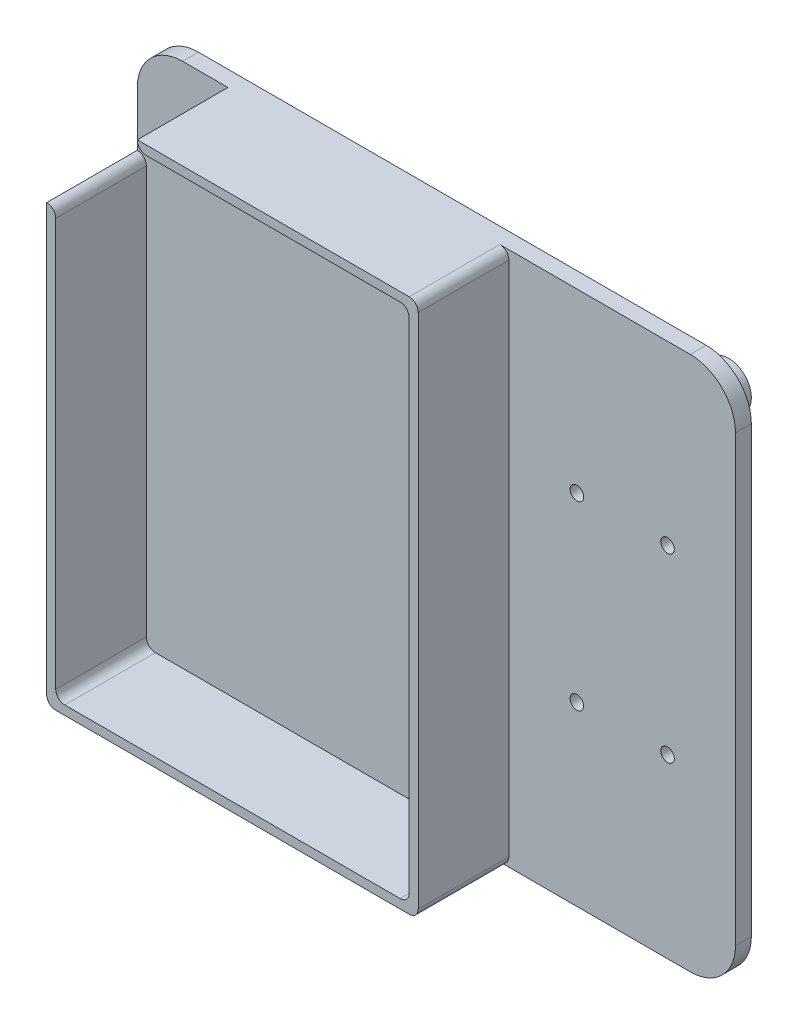
ISO-10303-21;
HEADER;
FILE_DESCRIPTION(('STEP AP214'),'2;1');
FILE_NAME('part.step','',(''),(''),'','','');
FILE_SCHEMA(('AUTOMOTIVE_DESIGN { 1 0 10303 214 1 1 1 1 }'));
ENDSEC;
DATA;
#1=APPLICATION_CONTEXT('core data for automotive mechanical design processes');
#2=APPLICATION_PROTOCOL_DEFINITION('international standard','automotive_design',2000,#1);
#3=PRODUCT_CONTEXT('',#1,'mechanical');
#4=PRODUCT('Part','Part','',(#3));
#5=PRODUCT_RELATED_PRODUCT_CATEGORY('part','',(#4));
#6=PRODUCT_DEFINITION_FORMATION('','',#4);
#7=PRODUCT_DEFINITION_CONTEXT('part definition',#1,'design');
#8=PRODUCT_DEFINITION('design','',#6,#7);
#9=PRODUCT_DEFINITION_SHAPE('','',#8);
#10=(LENGTH_UNIT() NAMED_UNIT(*) SI_UNIT(.MILLI.,.METRE.));
#11=(NAMED_UNIT(*) PLANE_ANGLE_UNIT() SI_UNIT($,.RADIAN.));
#12=(NAMED_UNIT(*) SI_UNIT($,.STERADIAN.) SOLID_ANGLE_UNIT());
#13=UNCERTAINTY_MEASURE_WITH_UNIT(LENGTH_MEASURE(1.E-05),#10,'distance_accuracy_value','');
#14=(GEOMETRIC_REPRESENTATION_CONTEXT(3) GLOBAL_UNCERTAINTY_ASSIGNED_CONTEXT((#13)) GLOBAL_UNIT_ASSIGNED_CONTEXT((#10,
#11,#12)) REPRESENTATION_CONTEXT('',''));
#15=CARTESIAN_POINT('',(0.,0.,0.));
#16=DIRECTION('',(0.,0.,1.));
#17=DIRECTION('',(1.,0.,0.));
#18=AXIS2_PLACEMENT_3D('',#15,#16,#17);
#19=CARTESIAN_POINT('',(-25.,59.,3.5));
#20=DIRECTION('',(0.,-1.,0.));
#21=DIRECTION('',(0.,0.,-1.));
#22=AXIS2_PLACEMENT_3D('',#19,#20,#21);
#23=PLANE('',#22);
#24=DIRECTION('',(-1.,0.,0.));
#25=VECTOR('',#24,1.);
#26=CARTESIAN_POINT('',(0.,59.,23.5));
#27=LINE('',#26,#25);
#28=CARTESIAN_POINT('',(-27.,59.,23.5));
#29=VERTEX_POINT('',#28);
#30=CARTESIAN_POINT('',(-87.,59.,23.5));
#31=VERTEX_POINT('',#30);
#32=EDGE_CURVE('E276',#29,#31,#27,.T.);
#33=ORIENTED_EDGE('',*,*,#32,.F.);
#34=DIRECTION('',(0.,0.,-1.));
#35=VECTOR('',#34,1.);
#36=CARTESIAN_POINT('',(-27.,59.,3.5));
#37=LINE('',#36,#35);
#38=CARTESIAN_POINT('',(-27.,59.,3.5));
#39=VERTEX_POINT('',#38);
#40=EDGE_CURVE('E376',#29,#39,#37,.T.);
#41=ORIENTED_EDGE('',*,*,#40,.T.);
#42=DIRECTION('',(-1.,0.,0.));
#43=VECTOR('',#42,1.);
#44=CARTESIAN_POINT('',(-25.,59.,3.5));
#45=LINE('',#44,#43);
#46=CARTESIAN_POINT('',(15.,59.,3.5));
#47=VERTEX_POINT('',#46);
#48=EDGE_CURVE('E311',#47,#39,#45,.T.);
#49=ORIENTED_EDGE('',*,*,#48,.F.);
#50=DIRECTION('',(0.,0.,-1.));
#51=VECTOR('',#50,1.);
#52=CARTESIAN_POINT('',(15.,59.,3.5));
#53=LINE('',#52,#51);
#54=CARTESIAN_POINT('',(15.,59.,0.));
#55=VERTEX_POINT('',#54);
#56=EDGE_CURVE('E341',#47,#55,#53,.T.);
#57=ORIENTED_EDGE('',*,*,#56,.T.);
#58=DIRECTION('',(-1.,0.,0.));
#59=VECTOR('',#58,1.);
#60=CARTESIAN_POINT('',(-25.,59.,0.));
#61=LINE('',#60,#59);
#62=CARTESIAN_POINT('',(-97.,59.,0.));
#63=VERTEX_POINT('',#62);
#64=EDGE_CURVE('E320',#55,#63,#61,.T.);
#65=ORIENTED_EDGE('',*,*,#64,.T.);
#66=DIRECTION('',(0.,0.,-1.));
#67=VECTOR('',#66,1.);
#68=CARTESIAN_POINT('',(-97.,59.,3.5));
#69=LINE('',#68,#67);
#70=CARTESIAN_POINT('',(-97.,59.,3.5));
#71=VERTEX_POINT('',#70);
#72=EDGE_CURVE('E233',#63,#71,#69,.F.);
#73=ORIENTED_EDGE('',*,*,#72,.T.);
#74=DIRECTION('',(1.,0.,0.));
#75=VECTOR('',#74,1.);
#76=CARTESIAN_POINT('',(-25.,59.,3.5));
#77=LINE('',#76,#75);
#78=CARTESIAN_POINT('',(-87.,59.,3.5));
#79=VERTEX_POINT('',#78);
#80=EDGE_CURVE('E216',#71,#79,#77,.T.);
#81=ORIENTED_EDGE('',*,*,#80,.T.);
#82=DIRECTION('',(0.,0.,-1.));
#83=VECTOR('',#82,1.);
#84=CARTESIAN_POINT('',(-87.,59.,3.5));
#85=LINE('',#84,#83);
#86=EDGE_CURVE('E229',#31,#79,#85,.T.);
#87=ORIENTED_EDGE('',*,*,#86,.F.);
#88=EDGE_LOOP('',(#33,#41,#49,#57,#65,#73,#81,#87));
#89=FACE_BOUND('',#88,.T.);
#90=ADVANCED_FACE('F60',(#89),#23,.F.);
#91=CARTESIAN_POINT('',(0.,0.,23.5));
#92=DIRECTION('',(0.,0.,1.));
#93=DIRECTION('',(1.,0.,0.));
#94=AXIS2_PLACEMENT_3D('',#91,#92,#93);
#95=PLANE('',#94);
#96=DIRECTION('',(0.,-1.,0.));
#97=VECTOR('',#96,1.);
#98=CARTESIAN_POINT('',(-105.,0.,23.5));
#99=LINE('',#98,#97);
#100=CARTESIAN_POINT('',(-105.,35.,23.5));
#101=VERTEX_POINT('',#100);
#102=CARTESIAN_POINT('',(-105.,-55.,23.5));
#103=VERTEX_POINT('',#102);
#104=EDGE_CURVE('E254',#101,#103,#99,.T.);
#105=ORIENTED_EDGE('',*,*,#104,.F.);
#106=CARTESIAN_POINT('',(-107.,35.,23.5));
#107=DIRECTION('',(0.,0.,1.));
#108=DIRECTION('',(1.,0.,0.));
#109=AXIS2_PLACEMENT_3D('',#106,#107,#108);
#110=CIRCLE('',#109,2.);
#111=CARTESIAN_POINT('',(-107.,37.,23.5));
#112=VERTEX_POINT('',#111);
#113=EDGE_CURVE('E358',#101,#112,#110,.T.);
#114=ORIENTED_EDGE('',*,*,#113,.T.);
#115=DIRECTION('',(0.,-1.,0.));
#116=VECTOR('',#115,1.);
#117=CARTESIAN_POINT('',(-107.,0.,23.5));
#118=LINE('',#117,#116);
#119=CARTESIAN_POINT('',(-107.,-57.,23.5));
#120=VERTEX_POINT('',#119);
#121=EDGE_CURVE('E273',#112,#120,#118,.T.);
#122=ORIENTED_EDGE('',*,*,#121,.T.);
#123=CARTESIAN_POINT('',(-105.,-57.,23.5));
#124=DIRECTION('',(0.,0.,1.));
#125=DIRECTION('',(1.,0.,0.));
#126=AXIS2_PLACEMENT_3D('',#123,#124,#125);
#127=CIRCLE('',#126,2.);
#128=CARTESIAN_POINT('',(-105.,-59.,23.5));
#129=VERTEX_POINT('',#128);
#130=EDGE_CURVE('E353',#120,#129,#127,.T.);
#131=ORIENTED_EDGE('',*,*,#130,.T.);
#132=DIRECTION('',(1.,0.,0.));
#133=VECTOR('',#132,1.);
#134=CARTESIAN_POINT('',(0.,-59.,23.5));
#135=LINE('',#134,#133);
#136=CARTESIAN_POINT('',(-27.,-59.,23.5));
#137=VERTEX_POINT('',#136);
#138=EDGE_CURVE('E270',#129,#137,#135,.T.);
#139=ORIENTED_EDGE('',*,*,#138,.T.);
#140=CARTESIAN_POINT('',(-27.,-57.,23.5));
#141=DIRECTION('',(0.,0.,1.));
#142=DIRECTION('',(1.,0.,0.));
#143=AXIS2_PLACEMENT_3D('',#140,#141,#142);
#144=CIRCLE('',#143,2.);
#145=CARTESIAN_POINT('',(-25.,-57.,23.5));
#146=VERTEX_POINT('',#145);
#147=EDGE_CURVE('E355',#137,#146,#144,.T.);
#148=ORIENTED_EDGE('',*,*,#147,.T.);
#149=DIRECTION('',(0.,-1.,0.));
#150=VECTOR('',#149,1.);
#151=CARTESIAN_POINT('',(-25.,0.,23.5));
#152=LINE('',#151,#150);
#153=CARTESIAN_POINT('',(-25.,57.,23.5));
#154=VERTEX_POINT('',#153);
#155=EDGE_CURVE('E267',#154,#146,#152,.T.);
#156=ORIENTED_EDGE('',*,*,#155,.F.);
#157=CARTESIAN_POINT('',(-27.,57.,23.5));
#158=DIRECTION('',(0.,0.,1.));
#159=DIRECTION('',(1.,0.,0.));
#160=AXIS2_PLACEMENT_3D('',#157,#158,#159);
#161=CIRCLE('',#160,2.);
#162=EDGE_CURVE('E351',#154,#29,#161,.T.);
#163=ORIENTED_EDGE('',*,*,#162,.T.);
#164=ORIENTED_EDGE('',*,*,#32,.T.);
#165=CARTESIAN_POINT('',(-85.,59.,23.5));
#166=DIRECTION('',(0.,0.,1.));
#167=DIRECTION('',(1.,0.,0.));
#168=AXIS2_PLACEMENT_3D('',#165,#166,#167);
#169=CIRCLE('',#168,2.);
#170=CARTESIAN_POINT('',(-85.,57.,23.5));
#171=VERTEX_POINT('',#170);
#172=EDGE_CURVE('E238',#31,#171,#169,.T.);
#173=ORIENTED_EDGE('',*,*,#172,.T.);
#174=DIRECTION('',(-1.,0.,0.));
#175=VECTOR('',#174,1.);
#176=CARTESIAN_POINT('',(0.,57.,23.5));
#177=LINE('',#176,#175);
#178=CARTESIAN_POINT('',(-29.,57.,23.5));
#179=VERTEX_POINT('',#178);
#180=EDGE_CURVE('E257',#179,#171,#177,.T.);
#181=ORIENTED_EDGE('',*,*,#180,.F.);
#182=CARTESIAN_POINT('',(-29.,55.,23.5));
#183=DIRECTION('',(0.,0.,1.));
#184=DIRECTION('',(1.,0.,0.));
#185=AXIS2_PLACEMENT_3D('',#182,#183,#184);
#186=CIRCLE('',#185,2.);
#187=CARTESIAN_POINT('',(-27.,55.,23.5));
#188=VERTEX_POINT('',#187);
#189=EDGE_CURVE('E407',#179,#188,#186,.F.);
#190=ORIENTED_EDGE('',*,*,#189,.T.);
#191=DIRECTION('',(0.,-1.,0.));
#192=VECTOR('',#191,1.);
#193=CARTESIAN_POINT('',(-27.,0.,23.5));
#194=LINE('',#193,#192);
#195=CARTESIAN_POINT('',(-27.,-55.,23.5));
#196=VERTEX_POINT('',#195);
#197=EDGE_CURVE('E249',#188,#196,#194,.T.);
#198=ORIENTED_EDGE('',*,*,#197,.T.);
#199=CARTESIAN_POINT('',(-29.,-55.,23.5));
#200=DIRECTION('',(0.,0.,1.));
#201=DIRECTION('',(1.,0.,0.));
#202=AXIS2_PLACEMENT_3D('',#199,#200,#201);
#203=CIRCLE('',#202,2.);
#204=CARTESIAN_POINT('',(-29.,-57.,23.5));
#205=VERTEX_POINT('',#204);
#206=EDGE_CURVE('E405',#196,#205,#203,.F.);
#207=ORIENTED_EDGE('',*,*,#206,.T.);
#208=DIRECTION('',(1.,0.,0.));
#209=VECTOR('',#208,1.);
#210=CARTESIAN_POINT('',(0.,-57.,23.5));
#211=LINE('',#210,#209);
#212=CARTESIAN_POINT('',(-103.,-57.,23.5));
#213=VERTEX_POINT('',#212);
#214=EDGE_CURVE('E251',#213,#205,#211,.T.);
#215=ORIENTED_EDGE('',*,*,#214,.F.);
#216=CARTESIAN_POINT('',(-103.,-55.,23.5));
#217=DIRECTION('',(0.,0.,1.));
#218=DIRECTION('',(1.,0.,0.));
#219=AXIS2_PLACEMENT_3D('',#216,#217,#218);
#220=CIRCLE('',#219,2.);
#221=EDGE_CURVE('E403',#213,#103,#220,.F.);
#222=ORIENTED_EDGE('',*,*,#221,.T.);
#223=EDGE_LOOP('',(#105,#114,#122,#131,#139,#148,#156,#163,#164,#173,#181,#190,#198,#207,#215,#222));
#224=FACE_BOUND('',#223,.T.);
#225=ADVANCED_FACE('F464',(#224),#95,.T.);
#226=CARTESIAN_POINT('',(0.,57.,23.5));
#227=DIRECTION('',(0.,-1.,0.));
#228=DIRECTION('',(0.,0.,-1.));
#229=AXIS2_PLACEMENT_3D('',#226,#227,#228);
#230=PLANE('',#229);
#231=DIRECTION('',(-1.,0.,0.));
#232=VECTOR('',#231,1.);
#233=CARTESIAN_POINT('',(0.,57.,3.5));
#234=LINE('',#233,#232);
#235=CARTESIAN_POINT('',(-29.,57.,3.5));
#236=VERTEX_POINT('',#235);
#237=CARTESIAN_POINT('',(-85.,57.,3.5));
#238=VERTEX_POINT('',#237);
#239=EDGE_CURVE('E218',#236,#238,#234,.T.);
#240=ORIENTED_EDGE('',*,*,#239,.F.);
#241=DIRECTION('',(0.,0.,-1.));
#242=VECTOR('',#241,1.);
#243=CARTESIAN_POINT('',(-29.,57.,23.5));
#244=LINE('',#243,#242);
#245=EDGE_CURVE('E75',#236,#179,#244,.F.);
#246=ORIENTED_EDGE('',*,*,#245,.T.);
#247=ORIENTED_EDGE('',*,*,#180,.T.);
#248=DIRECTION('',(0.,0.,-1.));
#249=VECTOR('',#248,1.);
#250=CARTESIAN_POINT('',(-85.,57.,23.5));
#251=LINE('',#250,#249);
#252=EDGE_CURVE('E360',#171,#238,#251,.T.);
#253=ORIENTED_EDGE('',*,*,#252,.T.);
#254=EDGE_LOOP('',(#240,#246,#247,#253));
#255=FACE_BOUND('',#254,.T.);
#256=ADVANCED_FACE('F506',(#255),#230,.T.);
#257=CARTESIAN_POINT('',(0.,0.,3.5));
#258=DIRECTION('',(0.,0.,1.));
#259=DIRECTION('',(1.,0.,0.));
#260=AXIS2_PLACEMENT_3D('',#257,#258,#259);
#261=PLANE('',#260);
#262=CARTESIAN_POINT('',(9.99999999999999,-20.,3.5));
#263=DIRECTION('',(0.,0.,1.));
#264=DIRECTION('',(-1.,0.,0.));
#265=AXIS2_PLACEMENT_3D('',#262,#263,#264);
#266=CIRCLE('',#265,1.5);
#267=CARTESIAN_POINT('',(8.49999999999999,-20.,3.5));
#268=VERTEX_POINT('',#267);
#269=EDGE_CURVE('E283',#268,#268,#266,.T.);
#270=ORIENTED_EDGE('',*,*,#269,.F.);
#271=EDGE_LOOP('',(#270));
#272=FACE_BOUND('',#271,.T.);
#273=CARTESIAN_POINT('',(9.99999999999999,20.,3.5));
#274=DIRECTION('',(0.,0.,-1.));
#275=DIRECTION('',(-1.,0.,0.));
#276=AXIS2_PLACEMENT_3D('',#273,#274,#275);
#277=CIRCLE('',#276,1.5);
#278=CARTESIAN_POINT('',(8.49999999999999,20.,3.5));
#279=VERTEX_POINT('',#278);
#280=EDGE_CURVE('E287',#279,#279,#277,.T.);
#281=ORIENTED_EDGE('',*,*,#280,.T.);
#282=EDGE_LOOP('',(#281));
#283=FACE_BOUND('',#282,.T.);
#284=CARTESIAN_POINT('',(-9.99999999999999,-20.,3.5));
#285=DIRECTION('',(0.,0.,-1.));
#286=DIRECTION('',(1.,0.,0.));
#287=AXIS2_PLACEMENT_3D('',#284,#285,#286);
#288=CIRCLE('',#287,1.5);
#289=CARTESIAN_POINT('',(-8.49999999999999,-20.,3.5));
#290=VERTEX_POINT('',#289);
#291=EDGE_CURVE('E293',#290,#290,#288,.T.);
#292=ORIENTED_EDGE('',*,*,#291,.T.);
#293=EDGE_LOOP('',(#292));
#294=FACE_BOUND('',#293,.T.);
#295=CARTESIAN_POINT('',(-9.99999999999999,20.,3.5));
#296=DIRECTION('',(0.,0.,1.));
#297=DIRECTION('',(1.,0.,0.));
#298=AXIS2_PLACEMENT_3D('',#295,#296,#297);
#299=CIRCLE('',#298,1.5);
#300=CARTESIAN_POINT('',(-8.49999999999999,20.,3.5));
#301=VERTEX_POINT('',#300);
#302=EDGE_CURVE('E299',#301,#301,#299,.T.);
#303=ORIENTED_EDGE('',*,*,#302,.F.);
#304=EDGE_LOOP('',(#303));
#305=FACE_BOUND('',#304,.T.);
#306=DIRECTION('',(1.,0.,0.));
#307=VECTOR('',#306,1.);
#308=CARTESIAN_POINT('',(-25.,-59.,3.5));
#309=LINE('',#308,#307);
#310=CARTESIAN_POINT('',(-27.,-59.,3.5));
#311=VERTEX_POINT('',#310);
#312=CARTESIAN_POINT('',(15.,-59.,3.5));
#313=VERTEX_POINT('',#312);
#314=EDGE_CURVE('E314',#311,#313,#309,.T.);
#315=ORIENTED_EDGE('',*,*,#314,.T.);
#316=CARTESIAN_POINT('',(15.,-49.,3.5));
#317=DIRECTION('',(0.,0.,1.));
#318=DIRECTION('',(1.,0.,0.));
#319=AXIS2_PLACEMENT_3D('',#316,#317,#318);
#320=CIRCLE('',#319,10.);
#321=CARTESIAN_POINT('',(25.,-49.,3.5));
#322=VERTEX_POINT('',#321);
#323=EDGE_CURVE('E338',#313,#322,#320,.T.);
#324=ORIENTED_EDGE('',*,*,#323,.T.);
#325=DIRECTION('',(0.,1.,0.));
#326=VECTOR('',#325,1.);
#327=CARTESIAN_POINT('',(25.,59.,3.5));
#328=LINE('',#327,#326);
#329=CARTESIAN_POINT('',(25.,49.,3.5));
#330=VERTEX_POINT('',#329);
#331=EDGE_CURVE('E308',#322,#330,#328,.T.);
#332=ORIENTED_EDGE('',*,*,#331,.T.);
#333=CARTESIAN_POINT('',(15.,49.,3.5));
#334=DIRECTION('',(0.,0.,1.));
#335=DIRECTION('',(1.,0.,0.));
#336=AXIS2_PLACEMENT_3D('',#333,#334,#335);
#337=CIRCLE('',#336,10.);
#338=EDGE_CURVE('E336',#330,#47,#337,.T.);
#339=ORIENTED_EDGE('',*,*,#338,.T.);
#340=ORIENTED_EDGE('',*,*,#48,.T.);
#341=CARTESIAN_POINT('',(-27.,57.,3.5));
#342=DIRECTION('',(0.,0.,1.));
#343=DIRECTION('',(1.,0.,0.));
#344=AXIS2_PLACEMENT_3D('',#341,#342,#343);
#345=CIRCLE('',#344,2.);
#346=CARTESIAN_POINT('',(-25.,57.,3.5));
#347=VERTEX_POINT('',#346);
#348=EDGE_CURVE('E382',#39,#347,#345,.F.);
#349=ORIENTED_EDGE('',*,*,#348,.T.);
#350=DIRECTION('',(0.,-1.,0.));
#351=VECTOR('',#350,1.);
#352=CARTESIAN_POINT('',(-25.,0.,3.5));
#353=LINE('',#352,#351);
#354=CARTESIAN_POINT('',(-25.,-57.,3.5));
#355=VERTEX_POINT('',#354);
#356=EDGE_CURVE('E259',#347,#355,#353,.T.);
#357=ORIENTED_EDGE('',*,*,#356,.T.);
#358=CARTESIAN_POINT('',(-27.,-57.,3.5));
#359=DIRECTION('',(0.,0.,1.));
#360=DIRECTION('',(1.,0.,0.));
#361=AXIS2_PLACEMENT_3D('',#358,#359,#360);
#362=CIRCLE('',#361,2.);
#363=EDGE_CURVE('E223',#355,#311,#362,.F.);
#364=ORIENTED_EDGE('',*,*,#363,.T.);
#365=EDGE_LOOP('',(#315,#324,#332,#339,#340,#349,#357,#364));
#366=FACE_BOUND('',#365,.T.);
#367=ADVANCED_FACE('F489',(#272,#283,#294,#305,#366),#261,.T.);
#368=CARTESIAN_POINT('',(25.,59.,3.5));
#369=DIRECTION('',(-1.,0.,0.));
#370=DIRECTION('',(0.,-1.,0.));
#371=AXIS2_PLACEMENT_3D('',#368,#369,#370);
#372=PLANE('',#371);
#373=ORIENTED_EDGE('',*,*,#331,.F.);
#374=DIRECTION('',(0.,0.,-1.));
#375=VECTOR('',#374,1.);
#376=CARTESIAN_POINT('',(25.,-49.,3.5));
#377=LINE('',#376,#375);
#378=CARTESIAN_POINT('',(25.,-49.,0.));
#379=VERTEX_POINT('',#378);
#380=EDGE_CURVE('E324',#322,#379,#377,.T.);
#381=ORIENTED_EDGE('',*,*,#380,.T.);
#382=DIRECTION('',(0.,1.,0.));
#383=VECTOR('',#382,1.);
#384=CARTESIAN_POINT('',(25.,59.,0.));
#385=LINE('',#384,#383);
#386=CARTESIAN_POINT('',(25.,49.,0.));
#387=VERTEX_POINT('',#386);
#388=EDGE_CURVE('E305',#379,#387,#385,.T.);
#389=ORIENTED_EDGE('',*,*,#388,.T.);
#390=DIRECTION('',(0.,0.,-1.));
#391=VECTOR('',#390,1.);
#392=CARTESIAN_POINT('',(25.,49.,3.5));
#393=LINE('',#392,#391);
#394=EDGE_CURVE('E317',#387,#330,#393,.F.);
#395=ORIENTED_EDGE('',*,*,#394,.T.);
#396=EDGE_LOOP('',(#373,#381,#389,#395));
#397=FACE_BOUND('',#396,.T.);
#398=ADVANCED_FACE('F483',(#397),#372,.F.);
#399=CARTESIAN_POINT('',(-25.,-59.,3.5));
#400=DIRECTION('',(0.,1.,0.));
#401=DIRECTION('',(0.,0.,1.));
#402=AXIS2_PLACEMENT_3D('',#399,#400,#401);
#403=PLANE('',#402);
#404=ORIENTED_EDGE('',*,*,#314,.F.);
#405=DIRECTION('',(0.,0.,-1.));
#406=VECTOR('',#405,1.);
#407=CARTESIAN_POINT('',(-27.,-59.,23.5));
#408=LINE('',#407,#406);
#409=EDGE_CURVE('E369',#311,#137,#408,.F.);
#410=ORIENTED_EDGE('',*,*,#409,.T.);
#411=ORIENTED_EDGE('',*,*,#138,.F.);
#412=DIRECTION('',(0.,0.,1.));
#413=VECTOR('',#412,1.);
#414=CARTESIAN_POINT('',(-105.,-59.,0.));
#415=LINE('',#414,#413);
#416=CARTESIAN_POINT('',(-105.,-59.,0.));
#417=VERTEX_POINT('',#416);
#418=EDGE_CURVE('E367',#129,#417,#415,.F.);
#419=ORIENTED_EDGE('',*,*,#418,.T.);
#420=DIRECTION('',(1.,0.,0.));
#421=VECTOR('',#420,1.);
#422=CARTESIAN_POINT('',(-25.,-59.,0.));
#423=LINE('',#422,#421);
#424=CARTESIAN_POINT('',(15.,-59.,0.));
#425=VERTEX_POINT('',#424);
#426=EDGE_CURVE('E312',#417,#425,#423,.T.);
#427=ORIENTED_EDGE('',*,*,#426,.T.);
#428=DIRECTION('',(0.,0.,-1.));
#429=VECTOR('',#428,1.);
#430=CARTESIAN_POINT('',(15.,-59.,3.5));
#431=LINE('',#430,#429);
#432=EDGE_CURVE('E334',#425,#313,#431,.F.);
#433=ORIENTED_EDGE('',*,*,#432,.T.);
#434=EDGE_LOOP('',(#404,#410,#411,#419,#427,#433));
#435=FACE_BOUND('',#434,.T.);
#436=ADVANCED_FACE('F429',(#435),#403,.F.);
#437=CARTESIAN_POINT('',(0.,0.,0.));
#438=DIRECTION('',(0.,0.,1.));
#439=DIRECTION('',(1.,0.,0.));
#440=AXIS2_PLACEMENT_3D('',#437,#438,#439);
#441=PLANE('',#440);
#442=CARTESIAN_POINT('',(-41.,-49.,0.));
#443=DIRECTION('',(0.,0.,1.));
#444=DIRECTION('',(1.,0.,0.));
#445=AXIS2_PLACEMENT_3D('',#442,#443,#444);
#446=CIRCLE('',#445,5.);
#447=CARTESIAN_POINT('',(-36.,-49.,0.));
#448=VERTEX_POINT('',#447);
#449=EDGE_CURVE('E12',#448,#448,#446,.F.);
#450=ORIENTED_EDGE('',*,*,#449,.F.);
#451=EDGE_LOOP('',(#450));
#452=FACE_BOUND('',#451,.T.);
#453=CARTESIAN_POINT('',(-41.,49.,0.));
#454=DIRECTION('',(0.,0.,1.));
#455=DIRECTION('',(1.,0.,0.));
#456=AXIS2_PLACEMENT_3D('',#453,#454,#455);
#457=CIRCLE('',#456,5.);
#458=CARTESIAN_POINT('',(-36.,49.,0.));
#459=VERTEX_POINT('',#458);
#460=EDGE_CURVE('E68',#459,#459,#457,.F.);
#461=ORIENTED_EDGE('',*,*,#460,.F.);
#462=EDGE_LOOP('',(#461));
#463=FACE_BOUND('',#462,.T.);
#464=CARTESIAN_POINT('',(-97.,-49.,0.));
#465=DIRECTION('',(0.,0.,1.));
#466=DIRECTION('',(1.,0.,0.));
#467=AXIS2_PLACEMENT_3D('',#464,#465,#466);
#468=CIRCLE('',#467,5.00000000000001);
#469=CARTESIAN_POINT('',(-92.,-49.,0.));
#470=VERTEX_POINT('',#469);
#471=EDGE_CURVE('E418',#470,#470,#468,.F.);
#472=ORIENTED_EDGE('',*,*,#471,.F.);
#473=EDGE_LOOP('',(#472));
#474=FACE_BOUND('',#473,.T.);
#475=CARTESIAN_POINT('',(15.,-49.,0.));
#476=DIRECTION('',(0.,0.,1.));
#477=DIRECTION('',(1.,0.,0.));
#478=AXIS2_PLACEMENT_3D('',#475,#476,#477);
#479=CIRCLE('',#478,5.);
#480=CARTESIAN_POINT('',(20.,-49.,0.));
#481=VERTEX_POINT('',#480);
#482=EDGE_CURVE('E415',#481,#481,#479,.F.);
#483=ORIENTED_EDGE('',*,*,#482,.F.);
#484=EDGE_LOOP('',(#483));
#485=FACE_BOUND('',#484,.T.);
#486=CARTESIAN_POINT('',(-97.,49.,0.));
#487=DIRECTION('',(0.,0.,1.));
#488=DIRECTION('',(1.,0.,0.));
#489=AXIS2_PLACEMENT_3D('',#486,#487,#488);
#490=CIRCLE('',#489,5.00000000000001);
#491=CARTESIAN_POINT('',(-92.,49.,0.));
#492=VERTEX_POINT('',#491);
#493=EDGE_CURVE('E412',#492,#492,#490,.F.);
#494=ORIENTED_EDGE('',*,*,#493,.F.);
#495=EDGE_LOOP('',(#494));
#496=FACE_BOUND('',#495,.T.);
#497=CARTESIAN_POINT('',(15.,49.,0.));
#498=DIRECTION('',(0.,0.,1.));
#499=DIRECTION('',(1.,0.,0.));
#500=AXIS2_PLACEMENT_3D('',#497,#498,#499);
#501=CIRCLE('',#500,5.);
#502=CARTESIAN_POINT('',(20.,49.,0.));
#503=VERTEX_POINT('',#502);
#504=EDGE_CURVE('E409',#503,#503,#501,.F.);
#505=ORIENTED_EDGE('',*,*,#504,.F.);
#506=EDGE_LOOP('',(#505));
#507=FACE_BOUND('',#506,.T.);
#508=CARTESIAN_POINT('',(9.99999999999999,-20.,0.));
#509=DIRECTION('',(0.,0.,1.));
#510=DIRECTION('',(-1.,0.,0.));
#511=AXIS2_PLACEMENT_3D('',#508,#509,#510);
#512=CIRCLE('',#511,1.5);
#513=CARTESIAN_POINT('',(8.49999999999999,-20.,0.));
#514=VERTEX_POINT('',#513);
#515=EDGE_CURVE('E284',#514,#514,#512,.T.);
#516=ORIENTED_EDGE('',*,*,#515,.T.);
#517=EDGE_LOOP('',(#516));
#518=FACE_BOUND('',#517,.T.);
#519=CARTESIAN_POINT('',(9.99999999999999,20.,0.));
#520=DIRECTION('',(0.,0.,-1.));
#521=DIRECTION('',(-1.,0.,0.));
#522=AXIS2_PLACEMENT_3D('',#519,#520,#521);
#523=CIRCLE('',#522,1.5);
#524=CARTESIAN_POINT('',(8.49999999999999,20.,0.));
#525=VERTEX_POINT('',#524);
#526=EDGE_CURVE('E290',#525,#525,#523,.T.);
#527=ORIENTED_EDGE('',*,*,#526,.F.);
#528=EDGE_LOOP('',(#527));
#529=FACE_BOUND('',#528,.T.);
#530=CARTESIAN_POINT('',(-9.99999999999999,-20.,0.));
#531=DIRECTION('',(0.,0.,-1.));
#532=DIRECTION('',(1.,0.,0.));
#533=AXIS2_PLACEMENT_3D('',#530,#531,#532);
#534=CIRCLE('',#533,1.5);
#535=CARTESIAN_POINT('',(-8.49999999999999,-20.,0.));
#536=VERTEX_POINT('',#535);
#537=EDGE_CURVE('E296',#536,#536,#534,.T.);
#538=ORIENTED_EDGE('',*,*,#537,.F.);
#539=EDGE_LOOP('',(#538));
#540=FACE_BOUND('',#539,.T.);
#541=CARTESIAN_POINT('',(-9.99999999999999,20.,0.));
#542=DIRECTION('',(0.,0.,1.));
#543=DIRECTION('',(1.,0.,0.));
#544=AXIS2_PLACEMENT_3D('',#541,#542,#543);
#545=CIRCLE('',#544,1.5);
#546=CARTESIAN_POINT('',(-8.49999999999999,20.,0.));
#547=VERTEX_POINT('',#546);
#548=EDGE_CURVE('E302',#547,#547,#545,.T.);
#549=ORIENTED_EDGE('',*,*,#548,.T.);
#550=EDGE_LOOP('',(#549));
#551=FACE_BOUND('',#550,.T.);
#552=ORIENTED_EDGE('',*,*,#426,.F.);
#553=CARTESIAN_POINT('',(-105.,-57.,0.));
#554=DIRECTION('',(0.,0.,1.));
#555=DIRECTION('',(1.,0.,0.));
#556=AXIS2_PLACEMENT_3D('',#553,#554,#555);
#557=CIRCLE('',#556,2.);
#558=CARTESIAN_POINT('',(-107.,-57.,0.));
#559=VERTEX_POINT('',#558);
#560=EDGE_CURVE('E374',#417,#559,#557,.F.);
#561=ORIENTED_EDGE('',*,*,#560,.T.);
#562=DIRECTION('',(0.,-1.,0.));
#563=VECTOR('',#562,1.);
#564=CARTESIAN_POINT('',(-107.,59.,0.));
#565=LINE('',#564,#563);
#566=CARTESIAN_POINT('',(-107.,49.,0.));
#567=VERTEX_POINT('',#566);
#568=EDGE_CURVE('E278',#567,#559,#565,.T.);
#569=ORIENTED_EDGE('',*,*,#568,.F.);
#570=CARTESIAN_POINT('',(-97.,49.,0.));
#571=DIRECTION('',(0.,0.,1.));
#572=DIRECTION('',(1.,0.,0.));
#573=AXIS2_PLACEMENT_3D('',#570,#571,#572);
#574=CIRCLE('',#573,10.);
#575=EDGE_CURVE('E327',#567,#63,#574,.F.);
#576=ORIENTED_EDGE('',*,*,#575,.T.);
#577=ORIENTED_EDGE('',*,*,#64,.F.);
#578=CARTESIAN_POINT('',(15.,49.,0.));
#579=DIRECTION('',(0.,0.,1.));
#580=DIRECTION('',(1.,0.,0.));
#581=AXIS2_PLACEMENT_3D('',#578,#579,#580);
#582=CIRCLE('',#581,10.);
#583=EDGE_CURVE('E329',#55,#387,#582,.F.);
#584=ORIENTED_EDGE('',*,*,#583,.T.);
#585=ORIENTED_EDGE('',*,*,#388,.F.);
#586=CARTESIAN_POINT('',(15.,-49.,0.));
#587=DIRECTION('',(0.,0.,1.));
#588=DIRECTION('',(1.,0.,0.));
#589=AXIS2_PLACEMENT_3D('',#586,#587,#588);
#590=CIRCLE('',#589,10.);
#591=EDGE_CURVE('E331',#379,#425,#590,.F.);
#592=ORIENTED_EDGE('',*,*,#591,.T.);
#593=EDGE_LOOP('',(#552,#561,#569,#576,#577,#584,#585,#592));
#594=FACE_BOUND('',#593,.T.);
#595=ADVANCED_FACE('F425',(#452,#463,#474,#485,#496,#507,#518,#529,#540,#551,#594),#441,.F.);
#596=CARTESIAN_POINT('',(-9.99999999999999,20.,0.));
#597=DIRECTION('',(0.,0.,1.));
#598=DIRECTION('',(1.,0.,0.));
#599=AXIS2_PLACEMENT_3D('',#596,#597,#598);
#600=CYLINDRICAL_SURFACE('',#599,1.5);
#601=ORIENTED_EDGE('',*,*,#548,.F.);
#602=EDGE_LOOP('',(#601));
#603=FACE_BOUND('',#602,.T.);
#604=ORIENTED_EDGE('',*,*,#302,.T.);
#605=EDGE_LOOP('',(#604));
#606=FACE_BOUND('',#605,.T.);
#607=ADVANCED_FACE('F428',(#603,#606),#600,.F.);
#608=CARTESIAN_POINT('',(-9.99999999999999,-20.,0.));
#609=DIRECTION('',(0.,0.,1.));
#610=DIRECTION('',(1.,0.,0.));
#611=AXIS2_PLACEMENT_3D('',#608,#609,#610);
#612=CYLINDRICAL_SURFACE('',#611,1.5);
#613=ORIENTED_EDGE('',*,*,#537,.T.);
#614=EDGE_LOOP('',(#613));
#615=FACE_BOUND('',#614,.T.);
#616=ORIENTED_EDGE('',*,*,#291,.F.);
#617=EDGE_LOOP('',(#616));
#618=FACE_BOUND('',#617,.T.);
#619=ADVANCED_FACE('F799',(#615,#618),#612,.F.);
#620=CARTESIAN_POINT('',(9.99999999999999,20.,0.));
#621=DIRECTION('',(0.,0.,1.));
#622=DIRECTION('',(1.,0.,0.));
#623=AXIS2_PLACEMENT_3D('',#620,#621,#622);
#624=CYLINDRICAL_SURFACE('',#623,1.5);
#625=ORIENTED_EDGE('',*,*,#526,.T.);
#626=EDGE_LOOP('',(#625));
#627=FACE_BOUND('',#626,.T.);
#628=ORIENTED_EDGE('',*,*,#280,.F.);
#629=EDGE_LOOP('',(#628));
#630=FACE_BOUND('',#629,.T.);
#631=ADVANCED_FACE('F806',(#627,#630),#624,.F.);
#632=CARTESIAN_POINT('',(9.99999999999999,-20.,0.));
#633=DIRECTION('',(0.,0.,1.));
#634=DIRECTION('',(1.,0.,0.));
#635=AXIS2_PLACEMENT_3D('',#632,#633,#634);
#636=CYLINDRICAL_SURFACE('',#635,1.5);
#637=ORIENTED_EDGE('',*,*,#515,.F.);
#638=EDGE_LOOP('',(#637));
#639=FACE_BOUND('',#638,.T.);
#640=ORIENTED_EDGE('',*,*,#269,.T.);
#641=EDGE_LOOP('',(#640));
#642=FACE_BOUND('',#641,.T.);
#643=ADVANCED_FACE('F814',(#639,#642),#636,.F.);
#644=CARTESIAN_POINT('',(-107.,0.,0.));
#645=DIRECTION('',(-1.,0.,0.));
#646=DIRECTION('',(0.,-1.,0.));
#647=AXIS2_PLACEMENT_3D('',#644,#645,#646);
#648=PLANE('',#647);
#649=ORIENTED_EDGE('',*,*,#568,.T.);
#650=DIRECTION('',(0.,0.,1.));
#651=VECTOR('',#650,1.);
#652=CARTESIAN_POINT('',(-107.,-57.,23.5));
#653=LINE('',#652,#651);
#654=EDGE_CURVE('E371',#559,#120,#653,.T.);
#655=ORIENTED_EDGE('',*,*,#654,.T.);
#656=ORIENTED_EDGE('',*,*,#121,.F.);
#657=DIRECTION('',(0.,0.,-1.));
#658=VECTOR('',#657,1.);
#659=CARTESIAN_POINT('',(-107.,37.,0.));
#660=LINE('',#659,#658);
#661=CARTESIAN_POINT('',(-107.,37.,3.5));
#662=VERTEX_POINT('',#661);
#663=EDGE_CURVE('E239',#112,#662,#660,.T.);
#664=ORIENTED_EDGE('',*,*,#663,.T.);
#665=DIRECTION('',(0.,1.,0.));
#666=VECTOR('',#665,1.);
#667=CARTESIAN_POINT('',(-107.,37.,3.5));
#668=LINE('',#667,#666);
#669=CARTESIAN_POINT('',(-107.,49.,3.5));
#670=VERTEX_POINT('',#669);
#671=EDGE_CURVE('E242',#662,#670,#668,.T.);
#672=ORIENTED_EDGE('',*,*,#671,.T.);
#673=DIRECTION('',(0.,0.,-1.));
#674=VECTOR('',#673,1.);
#675=CARTESIAN_POINT('',(-107.,49.,0.));
#676=LINE('',#675,#674);
#677=EDGE_CURVE('E344',#670,#567,#676,.T.);
#678=ORIENTED_EDGE('',*,*,#677,.T.);
#679=EDGE_LOOP('',(#649,#655,#656,#664,#672,#678));
#680=FACE_BOUND('',#679,.T.);
#681=ADVANCED_FACE('F460',(#680),#648,.T.);
#682=CARTESIAN_POINT('',(-25.,0.,23.5));
#683=DIRECTION('',(1.,0.,0.));
#684=DIRECTION('',(0.,1.,0.));
#685=AXIS2_PLACEMENT_3D('',#682,#683,#684);
#686=PLANE('',#685);
#687=ORIENTED_EDGE('',*,*,#155,.T.);
#688=DIRECTION('',(0.,0.,-1.));
#689=VECTOR('',#688,1.);
#690=CARTESIAN_POINT('',(-25.,-57.,3.5));
#691=LINE('',#690,#689);
#692=EDGE_CURVE('E364',#146,#355,#691,.T.);
#693=ORIENTED_EDGE('',*,*,#692,.T.);
#694=ORIENTED_EDGE('',*,*,#356,.F.);
#695=DIRECTION('',(0.,0.,-1.));
#696=VECTOR('',#695,1.);
#697=CARTESIAN_POINT('',(-25.,57.,23.5));
#698=LINE('',#697,#696);
#699=EDGE_CURVE('E362',#347,#154,#698,.F.);
#700=ORIENTED_EDGE('',*,*,#699,.T.);
#701=EDGE_LOOP('',(#687,#693,#694,#700));
#702=FACE_BOUND('',#701,.T.);
#703=ADVANCED_FACE('F499',(#702),#686,.T.);
#704=CARTESIAN_POINT('',(-27.,0.,23.5));
#705=DIRECTION('',(1.,0.,0.));
#706=DIRECTION('',(0.,1.,0.));
#707=AXIS2_PLACEMENT_3D('',#704,#705,#706);
#708=PLANE('',#707);
#709=DIRECTION('',(0.,-1.,0.));
#710=VECTOR('',#709,1.);
#711=CARTESIAN_POINT('',(-27.,0.,3.5));
#712=LINE('',#711,#710);
#713=CARTESIAN_POINT('',(-27.,55.,3.5));
#714=VERTEX_POINT('',#713);
#715=CARTESIAN_POINT('',(-27.,-55.,3.5));
#716=VERTEX_POINT('',#715);
#717=EDGE_CURVE('E248',#714,#716,#712,.T.);
#718=ORIENTED_EDGE('',*,*,#717,.T.);
#719=DIRECTION('',(0.,0.,-1.));
#720=VECTOR('',#719,1.);
#721=CARTESIAN_POINT('',(-27.,-55.,23.5));
#722=LINE('',#721,#720);
#723=EDGE_CURVE('E83',#716,#196,#722,.F.);
#724=ORIENTED_EDGE('',*,*,#723,.T.);
#725=ORIENTED_EDGE('',*,*,#197,.F.);
#726=DIRECTION('',(0.,0.,-1.));
#727=VECTOR('',#726,1.);
#728=CARTESIAN_POINT('',(-27.,55.,23.5));
#729=LINE('',#728,#727);
#730=EDGE_CURVE('E398',#188,#714,#729,.T.);
#731=ORIENTED_EDGE('',*,*,#730,.T.);
#732=EDGE_LOOP('',(#718,#724,#725,#731));
#733=FACE_BOUND('',#732,.T.);
#734=ADVANCED_FACE('F510',(#733),#708,.F.);
#735=CARTESIAN_POINT('',(-105.,0.,23.5));
#736=DIRECTION('',(1.,0.,0.));
#737=DIRECTION('',(0.,1.,0.));
#738=AXIS2_PLACEMENT_3D('',#735,#736,#737);
#739=PLANE('',#738);
#740=ORIENTED_EDGE('',*,*,#104,.T.);
#741=DIRECTION('',(0.,0.,-1.));
#742=VECTOR('',#741,1.);
#743=CARTESIAN_POINT('',(-105.,-55.,3.5));
#744=LINE('',#743,#742);
#745=CARTESIAN_POINT('',(-105.,-55.,3.5));
#746=VERTEX_POINT('',#745);
#747=EDGE_CURVE('E384',#103,#746,#744,.T.);
#748=ORIENTED_EDGE('',*,*,#747,.T.);
#749=DIRECTION('',(0.,-1.,0.));
#750=VECTOR('',#749,1.);
#751=CARTESIAN_POINT('',(-105.,0.,3.5));
#752=LINE('',#751,#750);
#753=CARTESIAN_POINT('',(-105.,35.,3.5));
#754=VERTEX_POINT('',#753);
#755=EDGE_CURVE('E264',#754,#746,#752,.T.);
#756=ORIENTED_EDGE('',*,*,#755,.F.);
#757=DIRECTION('',(0.,0.,-1.));
#758=VECTOR('',#757,1.);
#759=CARTESIAN_POINT('',(-105.,35.,23.5));
#760=LINE('',#759,#758);
#761=EDGE_CURVE('E349',#754,#101,#760,.F.);
#762=ORIENTED_EDGE('',*,*,#761,.T.);
#763=EDGE_LOOP('',(#740,#748,#756,#762));
#764=FACE_BOUND('',#763,.T.);
#765=ADVANCED_FACE('F526',(#764),#739,.T.);
#766=CARTESIAN_POINT('',(0.,-57.,23.5));
#767=DIRECTION('',(0.,1.,0.));
#768=DIRECTION('',(0.,0.,1.));
#769=AXIS2_PLACEMENT_3D('',#766,#767,#768);
#770=PLANE('',#769);
#771=DIRECTION('',(1.,0.,0.));
#772=VECTOR('',#771,1.);
#773=CARTESIAN_POINT('',(0.,-57.,3.5));
#774=LINE('',#773,#772);
#775=CARTESIAN_POINT('',(-103.,-57.,3.5));
#776=VERTEX_POINT('',#775);
#777=CARTESIAN_POINT('',(-29.,-57.,3.5));
#778=VERTEX_POINT('',#777);
#779=EDGE_CURVE('E261',#776,#778,#774,.T.);
#780=ORIENTED_EDGE('',*,*,#779,.F.);
#781=DIRECTION('',(0.,0.,-1.));
#782=VECTOR('',#781,1.);
#783=CARTESIAN_POINT('',(-103.,-57.,23.5));
#784=LINE('',#783,#782);
#785=EDGE_CURVE('E396',#776,#213,#784,.F.);
#786=ORIENTED_EDGE('',*,*,#785,.T.);
#787=ORIENTED_EDGE('',*,*,#214,.T.);
#788=DIRECTION('',(0.,0.,-1.));
#789=VECTOR('',#788,1.);
#790=CARTESIAN_POINT('',(-29.,-57.,23.5));
#791=LINE('',#790,#789);
#792=EDGE_CURVE('E393',#205,#778,#791,.T.);
#793=ORIENTED_EDGE('',*,*,#792,.T.);
#794=EDGE_LOOP('',(#780,#786,#787,#793));
#795=FACE_BOUND('',#794,.T.);
#796=ADVANCED_FACE('F517',(#795),#770,.T.);
#797=ORIENTED_EDGE('',*,*,#755,.T.);
#798=CARTESIAN_POINT('',(-103.,-55.,3.5));
#799=DIRECTION('',(0.,0.,1.));
#800=DIRECTION('',(1.,0.,0.));
#801=AXIS2_PLACEMENT_3D('',#798,#799,#800);
#802=CIRCLE('',#801,2.);
#803=EDGE_CURVE('E391',#746,#776,#802,.T.);
#804=ORIENTED_EDGE('',*,*,#803,.T.);
#805=ORIENTED_EDGE('',*,*,#779,.T.);
#806=CARTESIAN_POINT('',(-29.,-55.,3.5));
#807=DIRECTION('',(0.,0.,1.));
#808=DIRECTION('',(1.,0.,0.));
#809=AXIS2_PLACEMENT_3D('',#806,#807,#808);
#810=CIRCLE('',#809,2.);
#811=EDGE_CURVE('E389',#778,#716,#810,.T.);
#812=ORIENTED_EDGE('',*,*,#811,.T.);
#813=ORIENTED_EDGE('',*,*,#717,.F.);
#814=CARTESIAN_POINT('',(-29.,55.,3.5));
#815=DIRECTION('',(0.,0.,1.));
#816=DIRECTION('',(1.,0.,0.));
#817=AXIS2_PLACEMENT_3D('',#814,#815,#816);
#818=CIRCLE('',#817,2.);
#819=EDGE_CURVE('E387',#714,#236,#818,.T.);
#820=ORIENTED_EDGE('',*,*,#819,.T.);
#821=ORIENTED_EDGE('',*,*,#239,.T.);
#822=CARTESIAN_POINT('',(-85.,59.,3.5));
#823=DIRECTION('',(0.,0.,1.));
#824=DIRECTION('',(1.,0.,0.));
#825=AXIS2_PLACEMENT_3D('',#822,#823,#824);
#826=CIRCLE('',#825,2.);
#827=EDGE_CURVE('E212',#238,#79,#826,.F.);
#828=ORIENTED_EDGE('',*,*,#827,.T.);
#829=ORIENTED_EDGE('',*,*,#80,.F.);
#830=CARTESIAN_POINT('',(-97.,49.,3.5));
#831=DIRECTION('',(0.,0.,1.));
#832=DIRECTION('',(1.,0.,0.));
#833=AXIS2_PLACEMENT_3D('',#830,#831,#832);
#834=CIRCLE('',#833,10.);
#835=EDGE_CURVE('E347',#71,#670,#834,.T.);
#836=ORIENTED_EDGE('',*,*,#835,.T.);
#837=ORIENTED_EDGE('',*,*,#671,.F.);
#838=CARTESIAN_POINT('',(-107.,35.,3.5));
#839=DIRECTION('',(0.,0.,1.));
#840=DIRECTION('',(1.,0.,0.));
#841=AXIS2_PLACEMENT_3D('',#838,#839,#840);
#842=CIRCLE('',#841,2.);
#843=EDGE_CURVE('E224',#662,#754,#842,.F.);
#844=ORIENTED_EDGE('',*,*,#843,.T.);
#845=EDGE_LOOP('',(#797,#804,#805,#812,#813,#820,#821,#828,#829,#836,#837,#844));
#846=FACE_BOUND('',#845,.T.);
#847=ADVANCED_FACE('F215',(#846),#261,.T.);
#848=CARTESIAN_POINT('',(15.,-49.,3.5));
#849=DIRECTION('',(0.,0.,-1.));
#850=DIRECTION('',(-1.,0.,0.));
#851=AXIS2_PLACEMENT_3D('',#848,#849,#850);
#852=CYLINDRICAL_SURFACE('',#851,10.);
#853=ORIENTED_EDGE('',*,*,#323,.F.);
#854=ORIENTED_EDGE('',*,*,#432,.F.);
#855=ORIENTED_EDGE('',*,*,#591,.F.);
#856=ORIENTED_EDGE('',*,*,#380,.F.);
#857=EDGE_LOOP('',(#853,#854,#855,#856));
#858=FACE_BOUND('',#857,.T.);
#859=ADVANCED_FACE('F487',(#858),#852,.T.);
#860=CARTESIAN_POINT('',(15.,49.,3.5));
#861=DIRECTION('',(0.,0.,-1.));
#862=DIRECTION('',(-1.,0.,0.));
#863=AXIS2_PLACEMENT_3D('',#860,#861,#862);
#864=CYLINDRICAL_SURFACE('',#863,10.);
#865=ORIENTED_EDGE('',*,*,#338,.F.);
#866=ORIENTED_EDGE('',*,*,#394,.F.);
#867=ORIENTED_EDGE('',*,*,#583,.F.);
#868=ORIENTED_EDGE('',*,*,#56,.F.);
#869=EDGE_LOOP('',(#865,#866,#867,#868));
#870=FACE_BOUND('',#869,.T.);
#871=ADVANCED_FACE('F479',(#870),#864,.T.);
#872=CARTESIAN_POINT('',(-97.,49.,0.));
#873=DIRECTION('',(0.,0.,1.));
#874=DIRECTION('',(1.,0.,0.));
#875=AXIS2_PLACEMENT_3D('',#872,#873,#874);
#876=CYLINDRICAL_SURFACE('',#875,10.);
#877=ORIENTED_EDGE('',*,*,#835,.F.);
#878=ORIENTED_EDGE('',*,*,#72,.F.);
#879=ORIENTED_EDGE('',*,*,#575,.F.);
#880=ORIENTED_EDGE('',*,*,#677,.F.);
#881=EDGE_LOOP('',(#877,#878,#879,#880));
#882=FACE_BOUND('',#881,.T.);
#883=ADVANCED_FACE('F473',(#882),#876,.T.);
#884=CARTESIAN_POINT('',(-107.,35.,0.));
#885=DIRECTION('',(0.,0.,1.));
#886=DIRECTION('',(1.,0.,0.));
#887=AXIS2_PLACEMENT_3D('',#884,#885,#886);
#888=CYLINDRICAL_SURFACE('',#887,2.);
#889=ORIENTED_EDGE('',*,*,#113,.F.);
#890=ORIENTED_EDGE('',*,*,#761,.F.);
#891=ORIENTED_EDGE('',*,*,#843,.F.);
#892=ORIENTED_EDGE('',*,*,#663,.F.);
#893=EDGE_LOOP('',(#889,#890,#891,#892));
#894=FACE_BOUND('',#893,.T.);
#895=ADVANCED_FACE('F469',(#894),#888,.T.);
#896=CARTESIAN_POINT('',(-85.,59.,23.5));
#897=DIRECTION('',(0.,0.,-1.));
#898=DIRECTION('',(-1.,0.,0.));
#899=AXIS2_PLACEMENT_3D('',#896,#897,#898);
#900=CYLINDRICAL_SURFACE('',#899,2.);
#901=ORIENTED_EDGE('',*,*,#172,.F.);
#902=ORIENTED_EDGE('',*,*,#86,.T.);
#903=ORIENTED_EDGE('',*,*,#827,.F.);
#904=ORIENTED_EDGE('',*,*,#252,.F.);
#905=EDGE_LOOP('',(#901,#902,#903,#904));
#906=FACE_BOUND('',#905,.T.);
#907=ADVANCED_FACE('F236',(#906),#900,.T.);
#908=CARTESIAN_POINT('',(-27.,-57.,23.5));
#909=DIRECTION('',(0.,0.,1.));
#910=DIRECTION('',(1.,0.,0.));
#911=AXIS2_PLACEMENT_3D('',#908,#909,#910);
#912=CYLINDRICAL_SURFACE('',#911,2.);
#913=ORIENTED_EDGE('',*,*,#147,.F.);
#914=ORIENTED_EDGE('',*,*,#409,.F.);
#915=ORIENTED_EDGE('',*,*,#363,.F.);
#916=ORIENTED_EDGE('',*,*,#692,.F.);
#917=EDGE_LOOP('',(#913,#914,#915,#916));
#918=FACE_BOUND('',#917,.T.);
#919=ADVANCED_FACE('F495',(#918),#912,.T.);
#920=CARTESIAN_POINT('',(-105.,-57.,0.));
#921=DIRECTION('',(0.,0.,-1.));
#922=DIRECTION('',(-1.,0.,0.));
#923=AXIS2_PLACEMENT_3D('',#920,#921,#922);
#924=CYLINDRICAL_SURFACE('',#923,2.);
#925=ORIENTED_EDGE('',*,*,#560,.F.);
#926=ORIENTED_EDGE('',*,*,#418,.F.);
#927=ORIENTED_EDGE('',*,*,#130,.F.);
#928=ORIENTED_EDGE('',*,*,#654,.F.);
#929=EDGE_LOOP('',(#925,#926,#927,#928));
#930=FACE_BOUND('',#929,.T.);
#931=ADVANCED_FACE('F457',(#930),#924,.T.);
#932=CARTESIAN_POINT('',(-27.,57.,3.5));
#933=DIRECTION('',(0.,0.,1.));
#934=DIRECTION('',(1.,0.,0.));
#935=AXIS2_PLACEMENT_3D('',#932,#933,#934);
#936=CYLINDRICAL_SURFACE('',#935,2.);
#937=ORIENTED_EDGE('',*,*,#162,.F.);
#938=ORIENTED_EDGE('',*,*,#699,.F.);
#939=ORIENTED_EDGE('',*,*,#348,.F.);
#940=ORIENTED_EDGE('',*,*,#40,.F.);
#941=EDGE_LOOP('',(#937,#938,#939,#940));
#942=FACE_BOUND('',#941,.T.);
#943=ADVANCED_FACE('F503',(#942),#936,.T.);
#944=CARTESIAN_POINT('',(-103.,-55.,23.5));
#945=DIRECTION('',(0.,0.,1.));
#946=DIRECTION('',(1.,0.,0.));
#947=AXIS2_PLACEMENT_3D('',#944,#945,#946);
#948=CYLINDRICAL_SURFACE('',#947,2.);
#949=ORIENTED_EDGE('',*,*,#221,.F.);
#950=ORIENTED_EDGE('',*,*,#785,.F.);
#951=ORIENTED_EDGE('',*,*,#803,.F.);
#952=ORIENTED_EDGE('',*,*,#747,.F.);
#953=EDGE_LOOP('',(#949,#950,#951,#952));
#954=FACE_BOUND('',#953,.T.);
#955=ADVANCED_FACE('F523',(#954),#948,.F.);
#956=CARTESIAN_POINT('',(-29.,-55.,23.5));
#957=DIRECTION('',(0.,0.,-1.));
#958=DIRECTION('',(-1.,0.,0.));
#959=AXIS2_PLACEMENT_3D('',#956,#957,#958);
#960=CYLINDRICAL_SURFACE('',#959,2.);
#961=ORIENTED_EDGE('',*,*,#206,.F.);
#962=ORIENTED_EDGE('',*,*,#723,.F.);
#963=ORIENTED_EDGE('',*,*,#811,.F.);
#964=ORIENTED_EDGE('',*,*,#792,.F.);
#965=EDGE_LOOP('',(#961,#962,#963,#964));
#966=FACE_BOUND('',#965,.T.);
#967=ADVANCED_FACE('F515',(#966),#960,.F.);
#968=CARTESIAN_POINT('',(-29.,55.,23.5));
#969=DIRECTION('',(0.,0.,-1.));
#970=DIRECTION('',(-1.,0.,0.));
#971=AXIS2_PLACEMENT_3D('',#968,#969,#970);
#972=CYLINDRICAL_SURFACE('',#971,2.);
#973=ORIENTED_EDGE('',*,*,#189,.F.);
#974=ORIENTED_EDGE('',*,*,#245,.F.);
#975=ORIENTED_EDGE('',*,*,#819,.F.);
#976=ORIENTED_EDGE('',*,*,#730,.F.);
#977=EDGE_LOOP('',(#973,#974,#975,#976));
#978=FACE_BOUND('',#977,.T.);
#979=ADVANCED_FACE('F62',(#978),#972,.F.);
#980=CARTESIAN_POINT('',(15.,49.,-5.));
#981=DIRECTION('',(0.,0.,1.));
#982=DIRECTION('',(1.,0.,0.));
#983=AXIS2_PLACEMENT_3D('',#980,#981,#982);
#984=CYLINDRICAL_SURFACE('',#983,5.);
#985=CARTESIAN_POINT('',(15.,49.,-5.));
#986=DIRECTION('',(0.,0.,-1.));
#987=DIRECTION('',(-1.,0.,0.));
#988=AXIS2_PLACEMENT_3D('',#985,#986,#987);
#989=CIRCLE('',#988,5.);
#990=CARTESIAN_POINT('',(9.99999999999998,49.,-5.));
#991=VERTEX_POINT('',#990);
#992=EDGE_CURVE('E234',#991,#991,#989,.T.);
#993=ORIENTED_EDGE('',*,*,#992,.F.);
#994=EDGE_LOOP('',(#993));
#995=FACE_BOUND('',#994,.T.);
#996=ORIENTED_EDGE('',*,*,#504,.T.);
#997=EDGE_LOOP('',(#996));
#998=FACE_BOUND('',#997,.T.);
#999=ADVANCED_FACE('F567',(#995,#998),#984,.T.);
#1000=CARTESIAN_POINT('',(15.,49.,-5.));
#1001=DIRECTION('',(0.,0.,-1.));
#1002=DIRECTION('',(-1.,0.,0.));
#1003=AXIS2_PLACEMENT_3D('',#1000,#1001,#1002);
#1004=PLANE('',#1003);
#1005=ORIENTED_EDGE('',*,*,#992,.T.);
#1006=EDGE_LOOP('',(#1005));
#1007=FACE_BOUND('',#1006,.T.);
#1008=ADVANCED_FACE('F571',(#1007),#1004,.T.);
#1009=CARTESIAN_POINT('',(-97.,49.,-5.));
#1010=DIRECTION('',(0.,0.,1.));
#1011=DIRECTION('',(1.,0.,0.));
#1012=AXIS2_PLACEMENT_3D('',#1009,#1010,#1011);
#1013=CYLINDRICAL_SURFACE('',#1012,5.00000000000001);
#1014=CARTESIAN_POINT('',(-97.,49.,-5.));
#1015=DIRECTION('',(0.,0.,-1.));
#1016=DIRECTION('',(-1.,0.,0.));
#1017=AXIS2_PLACEMENT_3D('',#1014,#1015,#1016);
#1018=CIRCLE('',#1017,5.00000000000001);
#1019=CARTESIAN_POINT('',(-102.,49.,-5.));
#1020=VERTEX_POINT('',#1019);
#1021=EDGE_CURVE('E782',#1020,#1020,#1018,.T.);
#1022=ORIENTED_EDGE('',*,*,#1021,.F.);
#1023=EDGE_LOOP('',(#1022));
#1024=FACE_BOUND('',#1023,.T.);
#1025=ORIENTED_EDGE('',*,*,#493,.T.);
#1026=EDGE_LOOP('',(#1025));
#1027=FACE_BOUND('',#1026,.T.);
#1028=ADVANCED_FACE('F577',(#1024,#1027),#1013,.T.);
#1029=CARTESIAN_POINT('',(-97.,49.,-5.));
#1030=DIRECTION('',(0.,0.,-1.));
#1031=DIRECTION('',(-1.,0.,0.));
#1032=AXIS2_PLACEMENT_3D('',#1029,#1030,#1031);
#1033=PLANE('',#1032);
#1034=ORIENTED_EDGE('',*,*,#1021,.T.);
#1035=EDGE_LOOP('',(#1034));
#1036=FACE_BOUND('',#1035,.T.);
#1037=ADVANCED_FACE('F665',(#1036),#1033,.T.);
#1038=CARTESIAN_POINT('',(15.,-49.,-5.));
#1039=DIRECTION('',(0.,0.,1.));
#1040=DIRECTION('',(1.,0.,0.));
#1041=AXIS2_PLACEMENT_3D('',#1038,#1039,#1040);
#1042=CYLINDRICAL_SURFACE('',#1041,5.);
#1043=CARTESIAN_POINT('',(15.,-49.,-5.));
#1044=DIRECTION('',(0.,0.,-1.));
#1045=DIRECTION('',(-1.,0.,0.));
#1046=AXIS2_PLACEMENT_3D('',#1043,#1044,#1045);
#1047=CIRCLE('',#1046,5.);
#1048=CARTESIAN_POINT('',(10.,-49.,-5.));
#1049=VERTEX_POINT('',#1048);
#1050=EDGE_CURVE('E779',#1049,#1049,#1047,.T.);
#1051=ORIENTED_EDGE('',*,*,#1050,.F.);
#1052=EDGE_LOOP('',(#1051));
#1053=FACE_BOUND('',#1052,.T.);
#1054=ORIENTED_EDGE('',*,*,#482,.T.);
#1055=EDGE_LOOP('',(#1054));
#1056=FACE_BOUND('',#1055,.T.);
#1057=ADVANCED_FACE('F674',(#1053,#1056),#1042,.T.);
#1058=CARTESIAN_POINT('',(15.,-49.,-5.));
#1059=DIRECTION('',(0.,0.,-1.));
#1060=DIRECTION('',(-1.,0.,0.));
#1061=AXIS2_PLACEMENT_3D('',#1058,#1059,#1060);
#1062=PLANE('',#1061);
#1063=ORIENTED_EDGE('',*,*,#1050,.T.);
#1064=EDGE_LOOP('',(#1063));
#1065=FACE_BOUND('',#1064,.T.);
#1066=ADVANCED_FACE('F684',(#1065),#1062,.T.);
#1067=CARTESIAN_POINT('',(-97.,-49.,-5.));
#1068=DIRECTION('',(0.,0.,1.));
#1069=DIRECTION('',(1.,0.,0.));
#1070=AXIS2_PLACEMENT_3D('',#1067,#1068,#1069);
#1071=CYLINDRICAL_SURFACE('',#1070,5.00000000000001);
#1072=CARTESIAN_POINT('',(-97.,-49.,-5.));
#1073=DIRECTION('',(0.,0.,-1.));
#1074=DIRECTION('',(-1.,0.,0.));
#1075=AXIS2_PLACEMENT_3D('',#1072,#1073,#1074);
#1076=CIRCLE('',#1075,5.00000000000001);
#1077=CARTESIAN_POINT('',(-102.,-49.,-5.));
#1078=VERTEX_POINT('',#1077);
#1079=EDGE_CURVE('E774',#1078,#1078,#1076,.T.);
#1080=ORIENTED_EDGE('',*,*,#1079,.F.);
#1081=EDGE_LOOP('',(#1080));
#1082=FACE_BOUND('',#1081,.T.);
#1083=ORIENTED_EDGE('',*,*,#471,.T.);
#1084=EDGE_LOOP('',(#1083));
#1085=FACE_BOUND('',#1084,.T.);
#1086=ADVANCED_FACE('F694',(#1082,#1085),#1071,.T.);
#1087=CARTESIAN_POINT('',(-97.,-49.,-5.));
#1088=DIRECTION('',(0.,0.,-1.));
#1089=DIRECTION('',(-1.,0.,0.));
#1090=AXIS2_PLACEMENT_3D('',#1087,#1088,#1089);
#1091=PLANE('',#1090);
#1092=ORIENTED_EDGE('',*,*,#1079,.T.);
#1093=EDGE_LOOP('',(#1092));
#1094=FACE_BOUND('',#1093,.T.);
#1095=ADVANCED_FACE('F704',(#1094),#1091,.T.);
#1096=CARTESIAN_POINT('',(-41.,49.,-5.));
#1097=DIRECTION('',(0.,0.,1.));
#1098=DIRECTION('',(1.,0.,0.));
#1099=AXIS2_PLACEMENT_3D('',#1096,#1097,#1098);
#1100=CYLINDRICAL_SURFACE('',#1099,5.);
#1101=CARTESIAN_POINT('',(-41.,49.,-5.));
#1102=DIRECTION('',(0.,0.,-1.));
#1103=DIRECTION('',(-1.,0.,0.));
#1104=AXIS2_PLACEMENT_3D('',#1101,#1102,#1103);
#1105=CIRCLE('',#1104,5.);
#1106=CARTESIAN_POINT('',(-46.,49.,-5.));
#1107=VERTEX_POINT('',#1106);
#1108=EDGE_CURVE('E771',#1107,#1107,#1105,.T.);
#1109=ORIENTED_EDGE('',*,*,#1108,.F.);
#1110=EDGE_LOOP('',(#1109));
#1111=FACE_BOUND('',#1110,.T.);
#1112=ORIENTED_EDGE('',*,*,#460,.T.);
#1113=EDGE_LOOP('',(#1112));
#1114=FACE_BOUND('',#1113,.T.);
#1115=ADVANCED_FACE('F423',(#1111,#1114),#1100,.T.);
#1116=CARTESIAN_POINT('',(-41.,49.,-5.));
#1117=DIRECTION('',(0.,0.,-1.));
#1118=DIRECTION('',(-1.,0.,0.));
#1119=AXIS2_PLACEMENT_3D('',#1116,#1117,#1118);
#1120=PLANE('',#1119);
#1121=ORIENTED_EDGE('',*,*,#1108,.T.);
#1122=EDGE_LOOP('',(#1121));
#1123=FACE_BOUND('',#1122,.T.);
#1124=ADVANCED_FACE('F734',(#1123),#1120,.T.);
#1125=CARTESIAN_POINT('',(-41.,-49.,-5.));
#1126=DIRECTION('',(0.,0.,1.));
#1127=DIRECTION('',(1.,0.,0.));
#1128=AXIS2_PLACEMENT_3D('',#1125,#1126,#1127);
#1129=CYLINDRICAL_SURFACE('',#1128,5.);
#1130=CARTESIAN_POINT('',(-41.,-49.,-5.));
#1131=DIRECTION('',(0.,0.,-1.));
#1132=DIRECTION('',(-1.,0.,0.));
#1133=AXIS2_PLACEMENT_3D('',#1130,#1131,#1132);
#1134=CIRCLE('',#1133,5.);
#1135=CARTESIAN_POINT('',(-46.,-49.,-5.));
#1136=VERTEX_POINT('',#1135);
#1137=EDGE_CURVE('E770',#1136,#1136,#1134,.T.);
#1138=ORIENTED_EDGE('',*,*,#1137,.F.);
#1139=EDGE_LOOP('',(#1138));
#1140=FACE_BOUND('',#1139,.T.);
#1141=ORIENTED_EDGE('',*,*,#449,.T.);
#1142=EDGE_LOOP('',(#1141));
#1143=FACE_BOUND('',#1142,.T.);
#1144=ADVANCED_FACE('F744',(#1140,#1143),#1129,.T.);
#1145=CARTESIAN_POINT('',(-41.,-49.,-5.));
#1146=DIRECTION('',(0.,0.,-1.));
#1147=DIRECTION('',(-1.,0.,0.));
#1148=AXIS2_PLACEMENT_3D('',#1145,#1146,#1147);
#1149=PLANE('',#1148);
#1150=ORIENTED_EDGE('',*,*,#1137,.T.);
#1151=EDGE_LOOP('',(#1150));
#1152=FACE_BOUND('',#1151,.T.);
#1153=ADVANCED_FACE('F754',(#1152),#1149,.T.);
#1154=CLOSED_SHELL('',(#90,#225,#256,#367,#398,#436,#595,#607,#619,#631,#643,#681,#703,#734,
#765,#796,#847,#859,#871,#883,#895,#907,#919,#931,#943,#955,#967,#979,#999,#1008,#1028,#1037,
#1057,#1066,#1086,#1095,#1115,#1124,#1144,#1153));
#1155=MANIFOLD_SOLID_BREP('B2',#1154);
#1156=ADVANCED_BREP_SHAPE_REPRESENTATION('',(#18,#1155),#14);
#1157=SHAPE_DEFINITION_REPRESENTATION(#9,#1156);
ENDSEC;
END-ISO-10303-21;
